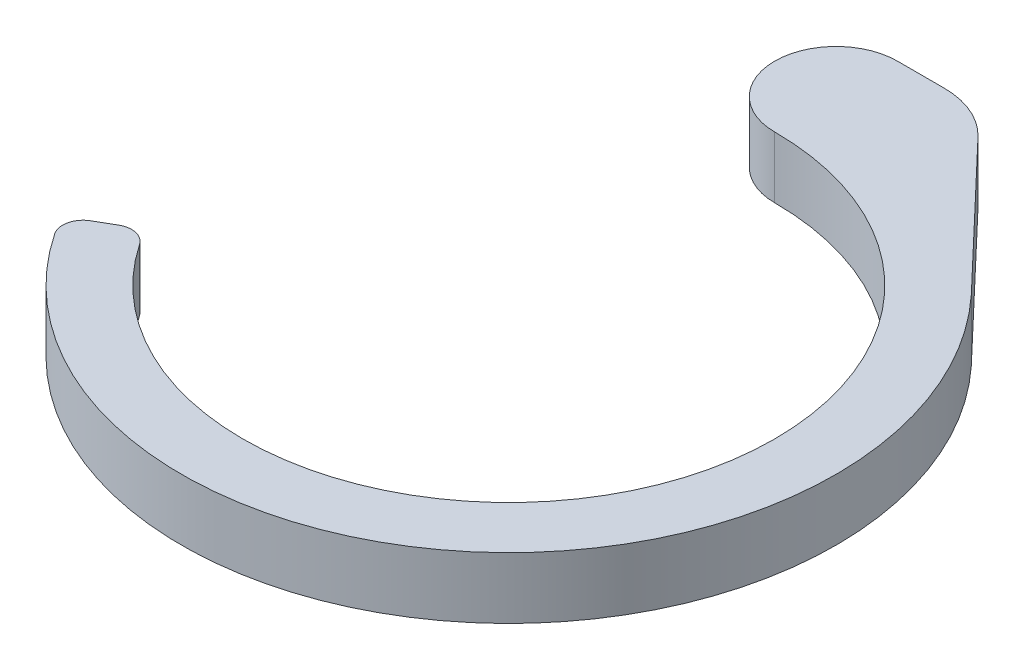
ISO-10303-21;
HEADER;
FILE_DESCRIPTION(('STEP AP214'),'2;1');
FILE_NAME('part.step','',(''),(''),'','','');
FILE_SCHEMA(('AUTOMOTIVE_DESIGN { 1 0 10303 214 1 1 1 1 }'));
ENDSEC;
DATA;
#1=APPLICATION_CONTEXT('core data for automotive mechanical design processes');
#2=APPLICATION_PROTOCOL_DEFINITION('international standard','automotive_design',2000,#1);
#3=PRODUCT_CONTEXT('',#1,'mechanical');
#4=PRODUCT('Part','Part','',(#3));
#5=PRODUCT_RELATED_PRODUCT_CATEGORY('part','',(#4));
#6=PRODUCT_DEFINITION_FORMATION('','',#4);
#7=PRODUCT_DEFINITION_CONTEXT('part definition',#1,'design');
#8=PRODUCT_DEFINITION('design','',#6,#7);
#9=PRODUCT_DEFINITION_SHAPE('','',#8);
#10=(LENGTH_UNIT() NAMED_UNIT(*) SI_UNIT(.MILLI.,.METRE.));
#11=(NAMED_UNIT(*) PLANE_ANGLE_UNIT() SI_UNIT($,.RADIAN.));
#12=(NAMED_UNIT(*) SI_UNIT($,.STERADIAN.) SOLID_ANGLE_UNIT());
#13=UNCERTAINTY_MEASURE_WITH_UNIT(LENGTH_MEASURE(1.E-05),#10,'distance_accuracy_value','');
#14=(GEOMETRIC_REPRESENTATION_CONTEXT(3) GLOBAL_UNCERTAINTY_ASSIGNED_CONTEXT((#13)) GLOBAL_UNIT_ASSIGNED_CONTEXT((#10,
#11,#12)) REPRESENTATION_CONTEXT('',''));
#15=CARTESIAN_POINT('',(0.,0.,0.));
#16=DIRECTION('',(0.,0.,1.));
#17=DIRECTION('',(1.,0.,0.));
#18=AXIS2_PLACEMENT_3D('',#15,#16,#17);
#19=CARTESIAN_POINT('',(-62.3074069840787,15.,41.7467008866615));
#20=DIRECTION('',(0.,-1.,0.));
#21=DIRECTION('',(0.,0.,-1.));
#22=AXIS2_PLACEMENT_3D('',#19,#20,#21);
#23=CYLINDRICAL_SURFACE('',#22,5.00000000000001);
#24=CARTESIAN_POINT('',(-62.3074069840787,0.,41.7467008866615));
#25=DIRECTION('',(0.,1.,0.));
#26=DIRECTION('',(0.,0.,1.));
#27=AXIS2_PLACEMENT_3D('',#24,#25,#26);
#28=CIRCLE('',#27,5.00000000000001);
#29=CARTESIAN_POINT('',(-66.4612341163506,0.,44.5298142791056));
#30=VERTEX_POINT('',#29);
#31=CARTESIAN_POINT('',(-64.8074069840787,0.,37.4165738677393));
#32=VERTEX_POINT('',#31);
#33=EDGE_CURVE('E136',#30,#32,#28,.F.);
#34=ORIENTED_EDGE('',*,*,#33,.F.);
#35=DIRECTION('',(0.,-1.,0.));
#36=VECTOR('',#35,1.);
#37=CARTESIAN_POINT('',(-66.4612341163506,15.,44.5298142791056));
#38=LINE('',#37,#36);
#39=CARTESIAN_POINT('',(-66.4612341163506,15.,44.5298142791056));
#40=VERTEX_POINT('',#39);
#41=EDGE_CURVE('E11',#40,#30,#38,.T.);
#42=ORIENTED_EDGE('',*,*,#41,.F.);
#43=CARTESIAN_POINT('',(-62.3074069840787,15.,41.7467008866615));
#44=DIRECTION('',(0.,1.,0.));
#45=DIRECTION('',(0.,0.,1.));
#46=AXIS2_PLACEMENT_3D('',#43,#44,#45);
#47=CIRCLE('',#46,5.00000000000001);
#48=CARTESIAN_POINT('',(-64.8074069840787,15.,37.4165738677393));
#49=VERTEX_POINT('',#48);
#50=EDGE_CURVE('E159',#40,#49,#47,.F.);
#51=ORIENTED_EDGE('',*,*,#50,.T.);
#52=DIRECTION('',(0.,-1.,0.));
#53=VECTOR('',#52,1.);
#54=CARTESIAN_POINT('',(-64.8074069840787,15.,37.4165738677393));
#55=LINE('',#54,#53);
#56=EDGE_CURVE('E88',#49,#32,#55,.T.);
#57=ORIENTED_EDGE('',*,*,#56,.T.);
#58=EDGE_LOOP('',(#34,#42,#51,#57));
#59=FACE_BOUND('',#58,.T.);
#60=ADVANCED_FACE('F35',(#59),#23,.T.);
#61=CARTESIAN_POINT('',(0.,15.,0.));
#62=DIRECTION('',(0.,-1.,0.));
#63=DIRECTION('',(0.,0.,-1.));
#64=AXIS2_PLACEMENT_3D('',#61,#62,#63);
#65=CYLINDRICAL_SURFACE('',#64,80.);
#66=CARTESIAN_POINT('',(0.,0.,0.));
#67=DIRECTION('',(0.,1.,0.));
#68=DIRECTION('',(0.,0.,1.));
#69=AXIS2_PLACEMENT_3D('',#66,#67,#68);
#70=CIRCLE('',#69,80.);
#71=CARTESIAN_POINT('',(58.5757297296054,0.,-54.4874654085159));
#72=VERTEX_POINT('',#71);
#73=EDGE_CURVE('E139',#30,#72,#70,.T.);
#74=ORIENTED_EDGE('',*,*,#73,.T.);
#75=DIRECTION('',(0.,-1.,0.));
#76=VECTOR('',#75,1.);
#77=CARTESIAN_POINT('',(58.5757297296054,15.,-54.4874654085159));
#78=LINE('',#77,#76);
#79=CARTESIAN_POINT('',(58.5757297296054,15.,-54.4874654085159));
#80=VERTEX_POINT('',#79);
#81=EDGE_CURVE('E43',#80,#72,#78,.T.);
#82=ORIENTED_EDGE('',*,*,#81,.F.);
#83=CARTESIAN_POINT('',(0.,15.,0.));
#84=DIRECTION('',(0.,1.,0.));
#85=DIRECTION('',(0.,0.,1.));
#86=AXIS2_PLACEMENT_3D('',#83,#84,#85);
#87=CIRCLE('',#86,80.);
#88=EDGE_CURVE('E189',#40,#80,#87,.T.);
#89=ORIENTED_EDGE('',*,*,#88,.F.);
#90=ORIENTED_EDGE('',*,*,#41,.T.);
#91=EDGE_LOOP('',(#74,#82,#89,#90));
#92=FACE_BOUND('',#91,.T.);
#93=ADVANCED_FACE('F177',(#92),#65,.T.);
#94=CARTESIAN_POINT('',(57.9325504327501,15.,-55.1629373618664));
#95=DIRECTION('',(0.724206102182212,0.,-0.689583585623996));
#96=DIRECTION('',(-0.689583585623996,0.,-0.724206102182212));
#97=AXIS2_PLACEMENT_3D('',#94,#95,#96);
#98=PLANE('',#97);
#99=DIRECTION('',(0.689583585623996,0.,0.724206102182212));
#100=VECTOR('',#99,1.);
#101=CARTESIAN_POINT('',(57.9325504327501,0.,-55.1629373618664));
#102=LINE('',#101,#100);
#103=CARTESIAN_POINT('',(25.911523347206,0.,-88.7916717124799));
#104=VERTEX_POINT('',#103);
#105=EDGE_CURVE('E143',#104,#72,#102,.T.);
#106=ORIENTED_EDGE('',*,*,#105,.F.);
#107=DIRECTION('',(0.,-1.,0.));
#108=VECTOR('',#107,1.);
#109=CARTESIAN_POINT('',(25.911523347206,15.,-88.7916717124799));
#110=LINE('',#109,#108);
#111=CARTESIAN_POINT('',(25.911523347206,15.,-88.7916717124799));
#112=VERTEX_POINT('',#111);
#113=EDGE_CURVE('E167',#112,#104,#110,.T.);
#114=ORIENTED_EDGE('',*,*,#113,.F.);
#115=DIRECTION('',(0.689583585623996,0.,0.724206102182212));
#116=VECTOR('',#115,1.);
#117=CARTESIAN_POINT('',(57.9325504327501,15.,-55.1629373618664));
#118=LINE('',#117,#116);
#119=EDGE_CURVE('E174',#112,#80,#118,.T.);
#120=ORIENTED_EDGE('',*,*,#119,.T.);
#121=ORIENTED_EDGE('',*,*,#81,.T.);
#122=EDGE_LOOP('',(#106,#114,#120,#121));
#123=FACE_BOUND('',#122,.T.);
#124=ADVANCED_FACE('F172',(#123),#98,.T.);
#125=CARTESIAN_POINT('',(11.4274013035615,15.,-75.));
#126=DIRECTION('',(0.,-1.,0.));
#127=DIRECTION('',(0.,0.,-1.));
#128=AXIS2_PLACEMENT_3D('',#125,#126,#127);
#129=CYLINDRICAL_SURFACE('',#128,20.0000000000001);
#130=CARTESIAN_POINT('',(11.4274013035615,0.,-75.));
#131=DIRECTION('',(0.,1.,0.));
#132=DIRECTION('',(0.,0.,1.));
#133=AXIS2_PLACEMENT_3D('',#130,#131,#132);
#134=CIRCLE('',#133,20.0000000000001);
#135=CARTESIAN_POINT('',(11.4274013035618,0.,-95.));
#136=VERTEX_POINT('',#135);
#137=EDGE_CURVE('E146',#136,#104,#134,.F.);
#138=ORIENTED_EDGE('',*,*,#137,.F.);
#139=DIRECTION('',(0.,-1.,0.));
#140=VECTOR('',#139,1.);
#141=CARTESIAN_POINT('',(11.4274013035618,15.,-95.));
#142=LINE('',#141,#140);
#143=CARTESIAN_POINT('',(11.4274013035618,15.,-95.));
#144=VERTEX_POINT('',#143);
#145=EDGE_CURVE('E165',#144,#136,#142,.T.);
#146=ORIENTED_EDGE('',*,*,#145,.F.);
#147=CARTESIAN_POINT('',(11.4274013035615,15.,-75.));
#148=DIRECTION('',(0.,1.,0.));
#149=DIRECTION('',(0.,0.,1.));
#150=AXIS2_PLACEMENT_3D('',#147,#148,#149);
#151=CIRCLE('',#150,20.0000000000001);
#152=EDGE_CURVE('E187',#144,#112,#151,.F.);
#153=ORIENTED_EDGE('',*,*,#152,.T.);
#154=ORIENTED_EDGE('',*,*,#113,.T.);
#155=EDGE_LOOP('',(#138,#146,#153,#154));
#156=FACE_BOUND('',#155,.T.);
#157=ADVANCED_FACE('F184',(#156),#129,.T.);
#158=CARTESIAN_POINT('',(-1.15370923512719E-13,15.,-95.));
#159=DIRECTION('',(0.,0.,-1.));
#160=DIRECTION('',(-1.,0.,0.));
#161=AXIS2_PLACEMENT_3D('',#158,#159,#160);
#162=PLANE('',#161);
#163=DIRECTION('',(1.,0.,0.));
#164=VECTOR('',#163,1.);
#165=CARTESIAN_POINT('',(-1.15370923512719E-13,0.,-95.));
#166=LINE('',#165,#164);
#167=CARTESIAN_POINT('',(0.,0.,-95.));
#168=VERTEX_POINT('',#167);
#169=EDGE_CURVE('E149',#168,#136,#166,.T.);
#170=ORIENTED_EDGE('',*,*,#169,.F.);
#171=DIRECTION('',(0.,-1.,0.));
#172=VECTOR('',#171,1.);
#173=CARTESIAN_POINT('',(0.,15.,-95.));
#174=LINE('',#173,#172);
#175=CARTESIAN_POINT('',(0.,15.,-95.));
#176=VERTEX_POINT('',#175);
#177=EDGE_CURVE('E163',#176,#168,#174,.T.);
#178=ORIENTED_EDGE('',*,*,#177,.F.);
#179=DIRECTION('',(1.,0.,0.));
#180=VECTOR('',#179,1.);
#181=CARTESIAN_POINT('',(-1.15370923512719E-13,15.,-95.));
#182=LINE('',#181,#180);
#183=EDGE_CURVE('E131',#176,#144,#182,.T.);
#184=ORIENTED_EDGE('',*,*,#183,.T.);
#185=ORIENTED_EDGE('',*,*,#145,.T.);
#186=EDGE_LOOP('',(#170,#178,#184,#185));
#187=FACE_BOUND('',#186,.T.);
#188=ADVANCED_FACE('F195',(#187),#162,.T.);
#189=CARTESIAN_POINT('',(0.,15.,-80.));
#190=DIRECTION('',(0.,-1.,0.));
#191=DIRECTION('',(0.,0.,-1.));
#192=AXIS2_PLACEMENT_3D('',#189,#190,#191);
#193=CYLINDRICAL_SURFACE('',#192,15.);
#194=CARTESIAN_POINT('',(0.,0.,-80.));
#195=DIRECTION('',(0.,1.,0.));
#196=DIRECTION('',(0.,0.,1.));
#197=AXIS2_PLACEMENT_3D('',#194,#195,#196);
#198=CIRCLE('',#197,15.);
#199=CARTESIAN_POINT('',(0.,0.,-65.));
#200=VERTEX_POINT('',#199);
#201=EDGE_CURVE('E152',#168,#200,#198,.T.);
#202=ORIENTED_EDGE('',*,*,#201,.T.);
#203=DIRECTION('',(0.,-1.,0.));
#204=VECTOR('',#203,1.);
#205=CARTESIAN_POINT('',(0.,15.,-65.));
#206=LINE('',#205,#204);
#207=CARTESIAN_POINT('',(0.,15.,-65.));
#208=VERTEX_POINT('',#207);
#209=EDGE_CURVE('E119',#208,#200,#206,.T.);
#210=ORIENTED_EDGE('',*,*,#209,.F.);
#211=CARTESIAN_POINT('',(0.,15.,-80.));
#212=DIRECTION('',(0.,1.,0.));
#213=DIRECTION('',(0.,0.,1.));
#214=AXIS2_PLACEMENT_3D('',#211,#212,#213);
#215=CIRCLE('',#214,15.);
#216=EDGE_CURVE('E128',#176,#208,#215,.T.);
#217=ORIENTED_EDGE('',*,*,#216,.F.);
#218=ORIENTED_EDGE('',*,*,#177,.T.);
#219=EDGE_LOOP('',(#202,#210,#217,#218));
#220=FACE_BOUND('',#219,.T.);
#221=ADVANCED_FACE('F197',(#220),#193,.T.);
#222=CARTESIAN_POINT('',(0.,15.,0.));
#223=DIRECTION('',(0.,-1.,0.));
#224=DIRECTION('',(0.,0.,-1.));
#225=AXIS2_PLACEMENT_3D('',#222,#223,#224);
#226=CYLINDRICAL_SURFACE('',#225,65.);
#227=CARTESIAN_POINT('',(0.,0.,0.));
#228=DIRECTION('',(0.,1.,0.));
#229=DIRECTION('',(0.,0.,1.));
#230=AXIS2_PLACEMENT_3D('',#227,#228,#229);
#231=CIRCLE('',#230,65.);
#232=CARTESIAN_POINT('',(-53.8264378899364,0.,36.4378180477484));
#233=VERTEX_POINT('',#232);
#234=EDGE_CURVE('E118',#233,#200,#231,.T.);
#235=ORIENTED_EDGE('',*,*,#234,.F.);
#236=DIRECTION('',(0.,-1.,0.));
#237=VECTOR('',#236,1.);
#238=CARTESIAN_POINT('',(-53.8264378899364,15.,36.4378180477484));
#239=LINE('',#238,#237);
#240=CARTESIAN_POINT('',(-53.8264378899364,15.,36.4378180477484));
#241=VERTEX_POINT('',#240);
#242=EDGE_CURVE('E112',#241,#233,#239,.T.);
#243=ORIENTED_EDGE('',*,*,#242,.F.);
#244=CARTESIAN_POINT('',(0.,15.,0.));
#245=DIRECTION('',(0.,1.,0.));
#246=DIRECTION('',(0.,0.,1.));
#247=AXIS2_PLACEMENT_3D('',#244,#245,#246);
#248=CIRCLE('',#247,65.);
#249=EDGE_CURVE('E116',#241,#208,#248,.T.);
#250=ORIENTED_EDGE('',*,*,#249,.T.);
#251=ORIENTED_EDGE('',*,*,#209,.T.);
#252=EDGE_LOOP('',(#235,#243,#250,#251));
#253=FACE_BOUND('',#252,.T.);
#254=ADVANCED_FACE('F114',(#253),#226,.F.);
#255=CARTESIAN_POINT('',(-57.9669331122392,15.,39.2407271283444));
#256=DIRECTION('',(0.,-1.,0.));
#257=DIRECTION('',(0.,0.,-1.));
#258=AXIS2_PLACEMENT_3D('',#255,#256,#257);
#259=CYLINDRICAL_SURFACE('',#258,5.);
#260=CARTESIAN_POINT('',(-57.9669331122392,0.,39.2407271283444));
#261=DIRECTION('',(0.,1.,0.));
#262=DIRECTION('',(0.,0.,1.));
#263=AXIS2_PLACEMENT_3D('',#260,#261,#262);
#264=CIRCLE('',#263,5.);
#265=CARTESIAN_POINT('',(-60.4669331122392,0.,34.9106001094222));
#266=VERTEX_POINT('',#265);
#267=EDGE_CURVE('E81',#233,#266,#264,.T.);
#268=ORIENTED_EDGE('',*,*,#267,.T.);
#269=DIRECTION('',(0.,-1.,0.));
#270=VECTOR('',#269,1.);
#271=CARTESIAN_POINT('',(-60.4669331122392,15.,34.9106001094222));
#272=LINE('',#271,#270);
#273=CARTESIAN_POINT('',(-60.4669331122392,15.,34.9106001094222));
#274=VERTEX_POINT('',#273);
#275=EDGE_CURVE('E120',#274,#266,#272,.T.);
#276=ORIENTED_EDGE('',*,*,#275,.F.);
#277=CARTESIAN_POINT('',(-57.9669331122392,15.,39.2407271283444));
#278=DIRECTION('',(0.,1.,0.));
#279=DIRECTION('',(0.,0.,1.));
#280=AXIS2_PLACEMENT_3D('',#277,#278,#279);
#281=CIRCLE('',#280,5.);
#282=EDGE_CURVE('E122',#241,#274,#281,.T.);
#283=ORIENTED_EDGE('',*,*,#282,.F.);
#284=ORIENTED_EDGE('',*,*,#242,.T.);
#285=EDGE_LOOP('',(#268,#276,#283,#284));
#286=FACE_BOUND('',#285,.T.);
#287=ADVANCED_FACE('F123',(#286),#259,.T.);
#288=CARTESIAN_POINT('',(0.,15.,0.));
#289=DIRECTION('',(0.499999999999997,0.,0.86602540378444));
#290=DIRECTION('',(0.86602540378444,0.,-0.499999999999997));
#291=AXIS2_PLACEMENT_3D('',#288,#289,#290);
#292=PLANE('',#291);
#293=DIRECTION('',(-0.86602540378444,0.,0.499999999999997));
#294=VECTOR('',#293,1.);
#295=CARTESIAN_POINT('',(0.,0.,0.));
#296=LINE('',#295,#294);
#297=EDGE_CURVE('E157',#266,#32,#296,.T.);
#298=ORIENTED_EDGE('',*,*,#297,.T.);
#299=ORIENTED_EDGE('',*,*,#56,.F.);
#300=DIRECTION('',(-0.86602540378444,0.,0.499999999999997));
#301=VECTOR('',#300,1.);
#302=CARTESIAN_POINT('',(0.,15.,0.));
#303=LINE('',#302,#301);
#304=EDGE_CURVE('E51',#274,#49,#303,.T.);
#305=ORIENTED_EDGE('',*,*,#304,.F.);
#306=ORIENTED_EDGE('',*,*,#275,.T.);
#307=EDGE_LOOP('',(#298,#299,#305,#306));
#308=FACE_BOUND('',#307,.T.);
#309=ADVANCED_FACE('F200',(#308),#292,.F.);
#310=CARTESIAN_POINT('',(0.,15.,0.));
#311=DIRECTION('',(0.,1.,0.));
#312=DIRECTION('',(0.,0.,1.));
#313=AXIS2_PLACEMENT_3D('',#310,#311,#312);
#314=PLANE('',#313);
#315=ORIENTED_EDGE('',*,*,#50,.F.);
#316=ORIENTED_EDGE('',*,*,#88,.T.);
#317=ORIENTED_EDGE('',*,*,#119,.F.);
#318=ORIENTED_EDGE('',*,*,#152,.F.);
#319=ORIENTED_EDGE('',*,*,#183,.F.);
#320=ORIENTED_EDGE('',*,*,#216,.T.);
#321=ORIENTED_EDGE('',*,*,#249,.F.);
#322=ORIENTED_EDGE('',*,*,#282,.T.);
#323=ORIENTED_EDGE('',*,*,#304,.T.);
#324=EDGE_LOOP('',(#315,#316,#317,#318,#319,#320,#321,#322,#323));
#325=FACE_BOUND('',#324,.T.);
#326=ADVANCED_FACE('F125',(#325),#314,.T.);
#327=CARTESIAN_POINT('',(0.,0.,0.));
#328=DIRECTION('',(0.,1.,0.));
#329=DIRECTION('',(0.,0.,1.));
#330=AXIS2_PLACEMENT_3D('',#327,#328,#329);
#331=PLANE('',#330);
#332=CARTESIAN_POINT('',(0.,0.,-80.));
#333=DIRECTION('',(0.,-1.,0.));
#334=DIRECTION('',(0.,0.,-1.));
#335=AXIS2_PLACEMENT_3D('',#332,#333,#334);
#336=CIRCLE('',#335,10.1);
#337=CARTESIAN_POINT('',(0.,0.,-90.1));
#338=VERTEX_POINT('',#337);
#339=EDGE_CURVE('E202',#338,#338,#336,.T.);
#340=ORIENTED_EDGE('',*,*,#339,.F.);
#341=EDGE_LOOP('',(#340));
#342=FACE_BOUND('',#341,.T.);
#343=ORIENTED_EDGE('',*,*,#33,.T.);
#344=ORIENTED_EDGE('',*,*,#297,.F.);
#345=ORIENTED_EDGE('',*,*,#267,.F.);
#346=ORIENTED_EDGE('',*,*,#234,.T.);
#347=ORIENTED_EDGE('',*,*,#201,.F.);
#348=ORIENTED_EDGE('',*,*,#169,.T.);
#349=ORIENTED_EDGE('',*,*,#137,.T.);
#350=ORIENTED_EDGE('',*,*,#105,.T.);
#351=ORIENTED_EDGE('',*,*,#73,.F.);
#352=EDGE_LOOP('',(#343,#344,#345,#346,#347,#348,#349,#350,#351));
#353=FACE_BOUND('',#352,.T.);
#354=ADVANCED_FACE('F179',(#342,#353),#331,.F.);
#355=CARTESIAN_POINT('',(0.,2.,-80.));
#356=DIRECTION('',(0.,-1.,0.));
#357=DIRECTION('',(0.,0.,-1.));
#358=AXIS2_PLACEMENT_3D('',#355,#356,#357);
#359=CYLINDRICAL_SURFACE('',#358,10.1);
#360=CARTESIAN_POINT('',(0.,2.,-80.));
#361=DIRECTION('',(0.,-1.,0.));
#362=DIRECTION('',(0.,0.,-1.));
#363=AXIS2_PLACEMENT_3D('',#360,#361,#362);
#364=CIRCLE('',#363,10.1);
#365=CARTESIAN_POINT('',(0.,2.,-90.1));
#366=VERTEX_POINT('',#365);
#367=EDGE_CURVE('E140',#366,#366,#364,.T.);
#368=ORIENTED_EDGE('',*,*,#367,.F.);
#369=EDGE_LOOP('',(#368));
#370=FACE_BOUND('',#369,.T.);
#371=ORIENTED_EDGE('',*,*,#339,.T.);
#372=EDGE_LOOP('',(#371));
#373=FACE_BOUND('',#372,.T.);
#374=ADVANCED_FACE('F210',(#370,#373),#359,.F.);
#375=CARTESIAN_POINT('',(0.,2.,-80.));
#376=DIRECTION('',(0.,-1.,0.));
#377=DIRECTION('',(0.,0.,-1.));
#378=AXIS2_PLACEMENT_3D('',#375,#376,#377);
#379=PLANE('',#378);
#380=ORIENTED_EDGE('',*,*,#367,.T.);
#381=EDGE_LOOP('',(#380));
#382=FACE_BOUND('',#381,.T.);
#383=ADVANCED_FACE('F208',(#382),#379,.T.);
#384=CLOSED_SHELL('',(#60,#93,#124,#157,#188,#221,#254,#287,#309,#326,#354,#374,#383));
#385=MANIFOLD_SOLID_BREP('B2',#384);
#386=ADVANCED_BREP_SHAPE_REPRESENTATION('',(#18,#385),#14);
#387=SHAPE_DEFINITION_REPRESENTATION(#9,#386);
ENDSEC;
END-ISO-10303-21;
